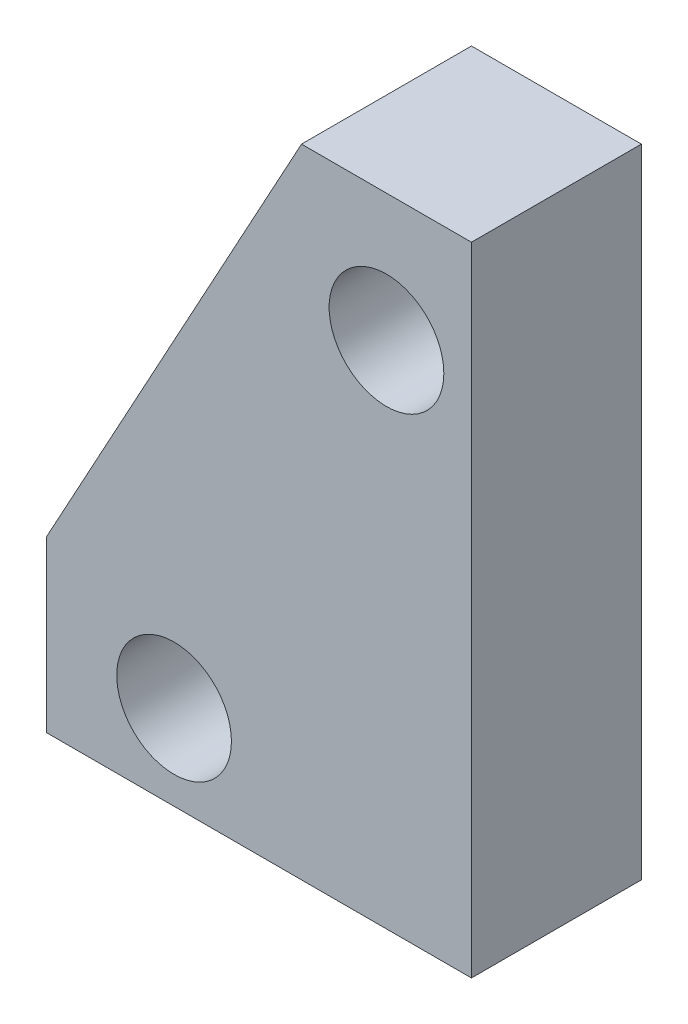
ISO-10303-21;
HEADER;
FILE_DESCRIPTION(('STEP AP214'),'2;1');
FILE_NAME('part.step','',(''),(''),'','','');
FILE_SCHEMA(('AUTOMOTIVE_DESIGN { 1 0 10303 214 1 1 1 1 }'));
ENDSEC;
DATA;
#1=APPLICATION_CONTEXT('core data for automotive mechanical design processes');
#2=APPLICATION_PROTOCOL_DEFINITION('international standard','automotive_design',2000,#1);
#3=PRODUCT_CONTEXT('',#1,'mechanical');
#4=PRODUCT('Part','Part','',(#3));
#5=PRODUCT_RELATED_PRODUCT_CATEGORY('part','',(#4));
#6=PRODUCT_DEFINITION_FORMATION('','',#4);
#7=PRODUCT_DEFINITION_CONTEXT('part definition',#1,'design');
#8=PRODUCT_DEFINITION('design','',#6,#7);
#9=PRODUCT_DEFINITION_SHAPE('','',#8);
#10=(LENGTH_UNIT() NAMED_UNIT(*) SI_UNIT(.MILLI.,.METRE.));
#11=(NAMED_UNIT(*) PLANE_ANGLE_UNIT() SI_UNIT($,.RADIAN.));
#12=(NAMED_UNIT(*) SI_UNIT($,.STERADIAN.) SOLID_ANGLE_UNIT());
#13=UNCERTAINTY_MEASURE_WITH_UNIT(LENGTH_MEASURE(1.E-05),#10,'distance_accuracy_value','');
#14=(GEOMETRIC_REPRESENTATION_CONTEXT(3) GLOBAL_UNCERTAINTY_ASSIGNED_CONTEXT((#13)) GLOBAL_UNIT_ASSIGNED_CONTEXT((#10,
#11,#12)) REPRESENTATION_CONTEXT('',''));
#15=CARTESIAN_POINT('',(0.,0.,0.));
#16=DIRECTION('',(0.,0.,1.));
#17=DIRECTION('',(1.,0.,0.));
#18=AXIS2_PLACEMENT_3D('',#15,#16,#17);
#19=CARTESIAN_POINT('',(0.,0.,4.));
#20=DIRECTION('',(0.,0.,1.));
#21=DIRECTION('',(1.,0.,0.));
#22=AXIS2_PLACEMENT_3D('',#19,#20,#21);
#23=PLANE('',#22);
#24=CARTESIAN_POINT('',(-169.133127490362,81.2018795674465,4.));
#25=DIRECTION('',(0.,0.,1.));
#26=DIRECTION('',(1.,0.,0.));
#27=AXIS2_PLACEMENT_3D('',#24,#25,#26);
#28=CIRCLE('',#27,1.34999999999998);
#29=CARTESIAN_POINT('',(-167.783127490362,81.2018795674465,4.));
#30=VERTEX_POINT('',#29);
#31=EDGE_CURVE('E112',#30,#30,#28,.T.);
#32=ORIENTED_EDGE('',*,*,#31,.F.);
#33=EDGE_LOOP('',(#32));
#34=FACE_BOUND('',#33,.T.);
#35=DIRECTION('',(0.,-1.,0.));
#36=VECTOR('',#35,1.);
#37=CARTESIAN_POINT('',(-172.133127490362,83.2018795674465,4.));
#38=LINE('',#37,#36);
#39=CARTESIAN_POINT('',(-172.133127490362,83.2018795674465,4.));
#40=VERTEX_POINT('',#39);
#41=CARTESIAN_POINT('',(-172.133127490362,79.2018795674465,4.));
#42=VERTEX_POINT('',#41);
#43=EDGE_CURVE('E117',#40,#42,#38,.T.);
#44=ORIENTED_EDGE('',*,*,#43,.T.);
#45=DIRECTION('',(1.,0.,0.));
#46=VECTOR('',#45,1.);
#47=CARTESIAN_POINT('',(-172.133127490362,79.2018795674465,4.));
#48=LINE('',#47,#46);
#49=CARTESIAN_POINT('',(-162.133127490362,79.2018795674465,4.));
#50=VERTEX_POINT('',#49);
#51=EDGE_CURVE('E84',#42,#50,#48,.T.);
#52=ORIENTED_EDGE('',*,*,#51,.T.);
#53=DIRECTION('',(0.,1.,0.));
#54=VECTOR('',#53,1.);
#55=CARTESIAN_POINT('',(-162.133127490362,79.2018795674465,4.));
#56=LINE('',#55,#54);
#57=CARTESIAN_POINT('',(-162.133127490362,94.2018795674465,4.));
#58=VERTEX_POINT('',#57);
#59=EDGE_CURVE('E88',#50,#58,#56,.T.);
#60=ORIENTED_EDGE('',*,*,#59,.T.);
#61=DIRECTION('',(-1.,0.,0.));
#62=VECTOR('',#61,1.);
#63=CARTESIAN_POINT('',(-162.133127490362,94.2018795674465,4.));
#64=LINE('',#63,#62);
#65=CARTESIAN_POINT('',(-166.133127490362,94.2018795674465,4.));
#66=VERTEX_POINT('',#65);
#67=EDGE_CURVE('E92',#58,#66,#64,.T.);
#68=ORIENTED_EDGE('',*,*,#67,.T.);
#69=DIRECTION('',(-0.478852130680577,-0.877895572914382,0.));
#70=VECTOR('',#69,1.);
#71=CARTESIAN_POINT('',(-166.133127490362,94.2018795674465,4.));
#72=LINE('',#71,#70);
#73=EDGE_CURVE('E50',#66,#40,#72,.T.);
#74=ORIENTED_EDGE('',*,*,#73,.T.);
#75=EDGE_LOOP('',(#44,#52,#60,#68,#74));
#76=FACE_BOUND('',#75,.T.);
#77=CARTESIAN_POINT('',(-164.133127490362,91.2018795674465,4.));
#78=DIRECTION('',(0.,0.,1.));
#79=DIRECTION('',(1.,0.,0.));
#80=AXIS2_PLACEMENT_3D('',#77,#78,#79);
#81=CIRCLE('',#80,1.34999999999998);
#82=CARTESIAN_POINT('',(-162.783127490362,91.2018795674465,4.));
#83=VERTEX_POINT('',#82);
#84=EDGE_CURVE('E154',#83,#83,#81,.T.);
#85=ORIENTED_EDGE('',*,*,#84,.F.);
#86=EDGE_LOOP('',(#85));
#87=FACE_BOUND('',#86,.T.);
#88=ADVANCED_FACE('F33',(#34,#76,#87),#23,.T.);
#89=CARTESIAN_POINT('',(0.,0.,0.));
#90=DIRECTION('',(0.,0.,1.));
#91=DIRECTION('',(1.,0.,0.));
#92=AXIS2_PLACEMENT_3D('',#89,#90,#91);
#93=PLANE('',#92);
#94=DIRECTION('',(0.,-1.,0.));
#95=VECTOR('',#94,1.);
#96=CARTESIAN_POINT('',(-172.133127490362,83.2018795674465,0.));
#97=LINE('',#96,#95);
#98=CARTESIAN_POINT('',(-172.133127490362,83.2018795674465,0.));
#99=VERTEX_POINT('',#98);
#100=CARTESIAN_POINT('',(-172.133127490362,79.2018795674465,0.));
#101=VERTEX_POINT('',#100);
#102=EDGE_CURVE('E108',#99,#101,#97,.T.);
#103=ORIENTED_EDGE('',*,*,#102,.F.);
#104=DIRECTION('',(-0.478852130680577,-0.877895572914382,0.));
#105=VECTOR('',#104,1.);
#106=CARTESIAN_POINT('',(-166.133127490362,94.2018795674465,0.));
#107=LINE('',#106,#105);
#108=CARTESIAN_POINT('',(-166.133127490362,94.2018795674465,0.));
#109=VERTEX_POINT('',#108);
#110=EDGE_CURVE('E76',#109,#99,#107,.T.);
#111=ORIENTED_EDGE('',*,*,#110,.F.);
#112=DIRECTION('',(-1.,0.,0.));
#113=VECTOR('',#112,1.);
#114=CARTESIAN_POINT('',(-162.133127490362,94.2018795674465,0.));
#115=LINE('',#114,#113);
#116=CARTESIAN_POINT('',(-162.133127490362,94.2018795674465,0.));
#117=VERTEX_POINT('',#116);
#118=EDGE_CURVE('E70',#117,#109,#115,.T.);
#119=ORIENTED_EDGE('',*,*,#118,.F.);
#120=DIRECTION('',(0.,1.,0.));
#121=VECTOR('',#120,1.);
#122=CARTESIAN_POINT('',(-162.133127490362,79.2018795674465,0.));
#123=LINE('',#122,#121);
#124=CARTESIAN_POINT('',(-162.133127490362,79.2018795674465,0.));
#125=VERTEX_POINT('',#124);
#126=EDGE_CURVE('E99',#125,#117,#123,.T.);
#127=ORIENTED_EDGE('',*,*,#126,.F.);
#128=DIRECTION('',(1.,0.,0.));
#129=VECTOR('',#128,1.);
#130=CARTESIAN_POINT('',(-172.133127490362,79.2018795674465,0.));
#131=LINE('',#130,#129);
#132=EDGE_CURVE('E111',#101,#125,#131,.T.);
#133=ORIENTED_EDGE('',*,*,#132,.F.);
#134=EDGE_LOOP('',(#103,#111,#119,#127,#133));
#135=FACE_BOUND('',#134,.T.);
#136=CARTESIAN_POINT('',(-169.133127490362,81.2018795674465,0.));
#137=DIRECTION('',(0.,0.,1.));
#138=DIRECTION('',(1.,0.,0.));
#139=AXIS2_PLACEMENT_3D('',#136,#137,#138);
#140=CIRCLE('',#139,1.34999999999998);
#141=CARTESIAN_POINT('',(-167.783127490362,81.2018795674465,0.));
#142=VERTEX_POINT('',#141);
#143=EDGE_CURVE('E160',#142,#142,#140,.T.);
#144=ORIENTED_EDGE('',*,*,#143,.T.);
#145=EDGE_LOOP('',(#144));
#146=FACE_BOUND('',#145,.T.);
#147=CARTESIAN_POINT('',(-164.133127490362,91.2018795674465,0.));
#148=DIRECTION('',(0.,0.,1.));
#149=DIRECTION('',(1.,0.,0.));
#150=AXIS2_PLACEMENT_3D('',#147,#148,#149);
#151=CIRCLE('',#150,1.34999999999998);
#152=CARTESIAN_POINT('',(-162.783127490362,91.2018795674465,0.));
#153=VERTEX_POINT('',#152);
#154=EDGE_CURVE('E157',#153,#153,#151,.T.);
#155=ORIENTED_EDGE('',*,*,#154,.T.);
#156=EDGE_LOOP('',(#155));
#157=FACE_BOUND('',#156,.T.);
#158=ADVANCED_FACE('F121',(#135,#146,#157),#93,.F.);
#159=CARTESIAN_POINT('',(-172.133127490362,83.2018795674465,4.));
#160=DIRECTION('',(1.,0.,0.));
#161=DIRECTION('',(0.,1.,0.));
#162=AXIS2_PLACEMENT_3D('',#159,#160,#161);
#163=PLANE('',#162);
#164=ORIENTED_EDGE('',*,*,#102,.T.);
#165=DIRECTION('',(0.,0.,-1.));
#166=VECTOR('',#165,1.);
#167=CARTESIAN_POINT('',(-172.133127490362,79.2018795674465,4.));
#168=LINE('',#167,#166);
#169=EDGE_CURVE('E11',#42,#101,#168,.T.);
#170=ORIENTED_EDGE('',*,*,#169,.F.);
#171=ORIENTED_EDGE('',*,*,#43,.F.);
#172=DIRECTION('',(0.,0.,-1.));
#173=VECTOR('',#172,1.);
#174=CARTESIAN_POINT('',(-172.133127490362,83.2018795674465,4.));
#175=LINE('',#174,#173);
#176=EDGE_CURVE('E104',#40,#99,#175,.T.);
#177=ORIENTED_EDGE('',*,*,#176,.T.);
#178=EDGE_LOOP('',(#164,#170,#171,#177));
#179=FACE_BOUND('',#178,.T.);
#180=ADVANCED_FACE('F35',(#179),#163,.F.);
#181=CARTESIAN_POINT('',(-172.133127490362,79.2018795674465,4.));
#182=DIRECTION('',(0.,1.,0.));
#183=DIRECTION('',(-1.,0.,0.));
#184=AXIS2_PLACEMENT_3D('',#181,#182,#183);
#185=PLANE('',#184);
#186=ORIENTED_EDGE('',*,*,#132,.T.);
#187=DIRECTION('',(0.,0.,-1.));
#188=VECTOR('',#187,1.);
#189=CARTESIAN_POINT('',(-162.133127490362,79.2018795674465,4.));
#190=LINE('',#189,#188);
#191=EDGE_CURVE('E42',#50,#125,#190,.T.);
#192=ORIENTED_EDGE('',*,*,#191,.F.);
#193=ORIENTED_EDGE('',*,*,#51,.F.);
#194=ORIENTED_EDGE('',*,*,#169,.T.);
#195=EDGE_LOOP('',(#186,#192,#193,#194));
#196=FACE_BOUND('',#195,.T.);
#197=ADVANCED_FACE('F192',(#196),#185,.F.);
#198=CARTESIAN_POINT('',(-162.133127490362,79.2018795674465,4.));
#199=DIRECTION('',(-1.,0.,0.));
#200=DIRECTION('',(0.,-1.,0.));
#201=AXIS2_PLACEMENT_3D('',#198,#199,#200);
#202=PLANE('',#201);
#203=ORIENTED_EDGE('',*,*,#126,.T.);
#204=DIRECTION('',(0.,0.,-1.));
#205=VECTOR('',#204,1.);
#206=CARTESIAN_POINT('',(-162.133127490362,94.2018795674465,4.));
#207=LINE('',#206,#205);
#208=EDGE_CURVE('E96',#58,#117,#207,.T.);
#209=ORIENTED_EDGE('',*,*,#208,.F.);
#210=ORIENTED_EDGE('',*,*,#59,.F.);
#211=ORIENTED_EDGE('',*,*,#191,.T.);
#212=EDGE_LOOP('',(#203,#209,#210,#211));
#213=FACE_BOUND('',#212,.T.);
#214=ADVANCED_FACE('F97',(#213),#202,.F.);
#215=CARTESIAN_POINT('',(-162.133127490362,94.2018795674465,4.));
#216=DIRECTION('',(0.,-1.,0.));
#217=DIRECTION('',(0.,0.,-1.));
#218=AXIS2_PLACEMENT_3D('',#215,#216,#217);
#219=PLANE('',#218);
#220=ORIENTED_EDGE('',*,*,#118,.T.);
#221=DIRECTION('',(0.,0.,-1.));
#222=VECTOR('',#221,1.);
#223=CARTESIAN_POINT('',(-166.133127490362,94.2018795674465,4.));
#224=LINE('',#223,#222);
#225=EDGE_CURVE('E100',#66,#109,#224,.T.);
#226=ORIENTED_EDGE('',*,*,#225,.F.);
#227=ORIENTED_EDGE('',*,*,#67,.F.);
#228=ORIENTED_EDGE('',*,*,#208,.T.);
#229=EDGE_LOOP('',(#220,#226,#227,#228));
#230=FACE_BOUND('',#229,.T.);
#231=ADVANCED_FACE('F102',(#230),#219,.F.);
#232=CARTESIAN_POINT('',(-166.133127490362,94.2018795674465,4.));
#233=DIRECTION('',(0.877895572914382,-0.478852130680577,0.));
#234=DIRECTION('',(0.478852130680577,0.877895572914382,0.));
#235=AXIS2_PLACEMENT_3D('',#232,#233,#234);
#236=PLANE('',#235);
#237=ORIENTED_EDGE('',*,*,#110,.T.);
#238=ORIENTED_EDGE('',*,*,#176,.F.);
#239=ORIENTED_EDGE('',*,*,#73,.F.);
#240=ORIENTED_EDGE('',*,*,#225,.T.);
#241=EDGE_LOOP('',(#237,#238,#239,#240));
#242=FACE_BOUND('',#241,.T.);
#243=ADVANCED_FACE('F126',(#242),#236,.F.);
#244=CARTESIAN_POINT('',(-169.133127490362,81.2018795674465,4.));
#245=DIRECTION('',(0.,0.,-1.));
#246=DIRECTION('',(-1.,0.,0.));
#247=AXIS2_PLACEMENT_3D('',#244,#245,#246);
#248=CYLINDRICAL_SURFACE('',#247,1.34999999999998);
#249=ORIENTED_EDGE('',*,*,#31,.T.);
#250=EDGE_LOOP('',(#249));
#251=FACE_BOUND('',#250,.T.);
#252=ORIENTED_EDGE('',*,*,#143,.F.);
#253=EDGE_LOOP('',(#252));
#254=FACE_BOUND('',#253,.T.);
#255=ADVANCED_FACE('F128',(#251,#254),#248,.F.);
#256=CARTESIAN_POINT('',(-164.133127490362,91.2018795674465,4.));
#257=DIRECTION('',(0.,0.,-1.));
#258=DIRECTION('',(-1.,0.,0.));
#259=AXIS2_PLACEMENT_3D('',#256,#257,#258);
#260=CYLINDRICAL_SURFACE('',#259,1.34999999999998);
#261=ORIENTED_EDGE('',*,*,#84,.T.);
#262=EDGE_LOOP('',(#261));
#263=FACE_BOUND('',#262,.T.);
#264=ORIENTED_EDGE('',*,*,#154,.F.);
#265=EDGE_LOOP('',(#264));
#266=FACE_BOUND('',#265,.T.);
#267=ADVANCED_FACE('F134',(#263,#266),#260,.F.);
#268=CLOSED_SHELL('',(#88,#158,#180,#197,#214,#231,#243,#255,#267));
#269=MANIFOLD_SOLID_BREP('B2',#268);
#270=ADVANCED_BREP_SHAPE_REPRESENTATION('',(#18,#269),#14);
#271=SHAPE_DEFINITION_REPRESENTATION(#9,#270);
ENDSEC;
END-ISO-10303-21;
